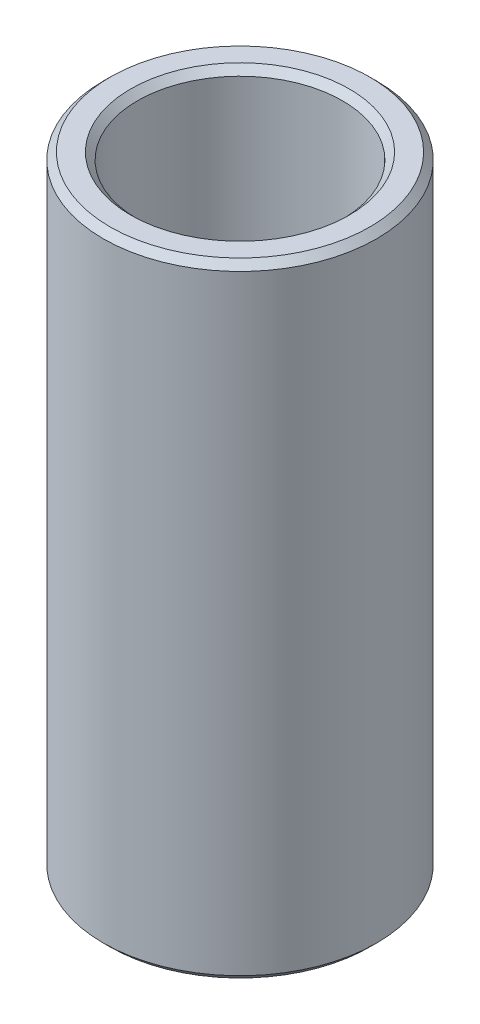
ISO-10303-21;
HEADER;
FILE_DESCRIPTION(('STEP AP214'),'2;1');
FILE_NAME('part.step','',(''),(''),'','','');
FILE_SCHEMA(('AUTOMOTIVE_DESIGN { 1 0 10303 214 1 1 1 1 }'));
ENDSEC;
DATA;
#1=APPLICATION_CONTEXT('core data for automotive mechanical design processes');
#2=APPLICATION_PROTOCOL_DEFINITION('international standard','automotive_design',2000,#1);
#3=PRODUCT_CONTEXT('',#1,'mechanical');
#4=PRODUCT('Part','Part','',(#3));
#5=PRODUCT_RELATED_PRODUCT_CATEGORY('part','',(#4));
#6=PRODUCT_DEFINITION_FORMATION('','',#4);
#7=PRODUCT_DEFINITION_CONTEXT('part definition',#1,'design');
#8=PRODUCT_DEFINITION('design','',#6,#7);
#9=PRODUCT_DEFINITION_SHAPE('','',#8);
#10=(LENGTH_UNIT() NAMED_UNIT(*) SI_UNIT(.MILLI.,.METRE.));
#11=(NAMED_UNIT(*) PLANE_ANGLE_UNIT() SI_UNIT($,.RADIAN.));
#12=(NAMED_UNIT(*) SI_UNIT($,.STERADIAN.) SOLID_ANGLE_UNIT());
#13=UNCERTAINTY_MEASURE_WITH_UNIT(LENGTH_MEASURE(1.E-05),#10,'distance_accuracy_value','');
#14=(GEOMETRIC_REPRESENTATION_CONTEXT(3) GLOBAL_UNCERTAINTY_ASSIGNED_CONTEXT((#13)) GLOBAL_UNIT_ASSIGNED_CONTEXT((#10,
#11,#12)) REPRESENTATION_CONTEXT('',''));
#15=CARTESIAN_POINT('',(0.,0.,0.));
#16=DIRECTION('',(0.,0.,1.));
#17=DIRECTION('',(1.,0.,0.));
#18=AXIS2_PLACEMENT_3D('',#15,#16,#17);
#19=CARTESIAN_POINT('',(0.,18.25,0.));
#20=DIRECTION('',(0.,1.,0.));
#21=DIRECTION('',(0.,0.,1.));
#22=AXIS2_PLACEMENT_3D('',#19,#20,#21);
#23=PLANE('',#22);
#24=CARTESIAN_POINT('',(0.,18.25,0.));
#25=DIRECTION('',(0.,1.,0.));
#26=DIRECTION('',(0.,0.,1.));
#27=AXIS2_PLACEMENT_3D('',#24,#25,#26);
#28=CIRCLE('',#27,3.8);
#29=CARTESIAN_POINT('',(0.,18.25,3.8));
#30=VERTEX_POINT('',#29);
#31=EDGE_CURVE('E45',#30,#30,#28,.T.);
#32=ORIENTED_EDGE('',*,*,#31,.T.);
#33=EDGE_LOOP('',(#32));
#34=FACE_BOUND('',#33,.T.);
#35=CARTESIAN_POINT('',(0.,18.25,0.));
#36=DIRECTION('',(0.,1.,0.));
#37=DIRECTION('',(0.,0.,1.));
#38=AXIS2_PLACEMENT_3D('',#35,#36,#37);
#39=CIRCLE('',#38,3.2);
#40=CARTESIAN_POINT('',(0.,18.25,3.2));
#41=VERTEX_POINT('',#40);
#42=EDGE_CURVE('E49',#41,#41,#39,.F.);
#43=ORIENTED_EDGE('',*,*,#42,.T.);
#44=EDGE_LOOP('',(#43));
#45=FACE_BOUND('',#44,.T.);
#46=ADVANCED_FACE('F34',(#34,#45),#23,.T.);
#47=CARTESIAN_POINT('',(0.,0.,0.));
#48=DIRECTION('',(0.,1.,0.));
#49=DIRECTION('',(0.,0.,1.));
#50=AXIS2_PLACEMENT_3D('',#47,#48,#49);
#51=PLANE('',#50);
#52=CARTESIAN_POINT('',(0.,0.,0.));
#53=DIRECTION('',(0.,1.,0.));
#54=DIRECTION('',(0.,0.,1.));
#55=AXIS2_PLACEMENT_3D('',#52,#53,#54);
#56=CIRCLE('',#55,3.8);
#57=CARTESIAN_POINT('',(0.,0.,3.8));
#58=VERTEX_POINT('',#57);
#59=EDGE_CURVE('E54',#58,#58,#56,.F.);
#60=ORIENTED_EDGE('',*,*,#59,.T.);
#61=EDGE_LOOP('',(#60));
#62=FACE_BOUND('',#61,.T.);
#63=CARTESIAN_POINT('',(0.,0.,0.));
#64=DIRECTION('',(0.,1.,0.));
#65=DIRECTION('',(0.,0.,1.));
#66=AXIS2_PLACEMENT_3D('',#63,#64,#65);
#67=CIRCLE('',#66,3.2);
#68=CARTESIAN_POINT('',(0.,0.,3.2));
#69=VERTEX_POINT('',#68);
#70=EDGE_CURVE('E57',#69,#69,#67,.T.);
#71=ORIENTED_EDGE('',*,*,#70,.T.);
#72=EDGE_LOOP('',(#71));
#73=FACE_BOUND('',#72,.T.);
#74=ADVANCED_FACE('F79',(#62,#73),#51,.F.);
#75=CARTESIAN_POINT('',(0.,18.25,0.));
#76=DIRECTION('',(0.,-1.,0.));
#77=DIRECTION('',(0.,0.,-1.));
#78=AXIS2_PLACEMENT_3D('',#75,#76,#77);
#79=CYLINDRICAL_SURFACE('',#78,4.);
#80=CARTESIAN_POINT('',(0.,0.199999999999995,0.));
#81=DIRECTION('',(0.,1.,0.));
#82=DIRECTION('',(0.,0.,1.));
#83=AXIS2_PLACEMENT_3D('',#80,#81,#82);
#84=CIRCLE('',#83,4.);
#85=CARTESIAN_POINT('',(0.,0.199999999999995,4.));
#86=VERTEX_POINT('',#85);
#87=EDGE_CURVE('E60',#86,#86,#84,.T.);
#88=ORIENTED_EDGE('',*,*,#87,.T.);
#89=EDGE_LOOP('',(#88));
#90=FACE_BOUND('',#89,.T.);
#91=CARTESIAN_POINT('',(0.,18.05,0.));
#92=DIRECTION('',(0.,1.,0.));
#93=DIRECTION('',(0.,0.,1.));
#94=AXIS2_PLACEMENT_3D('',#91,#92,#93);
#95=CIRCLE('',#94,4.);
#96=CARTESIAN_POINT('',(0.,18.05,4.));
#97=VERTEX_POINT('',#96);
#98=EDGE_CURVE('E63',#97,#97,#95,.F.);
#99=ORIENTED_EDGE('',*,*,#98,.T.);
#100=EDGE_LOOP('',(#99));
#101=FACE_BOUND('',#100,.T.);
#102=ADVANCED_FACE('F67',(#90,#101),#79,.T.);
#103=CARTESIAN_POINT('',(0.,18.25,0.));
#104=DIRECTION('',(0.,-1.,0.));
#105=DIRECTION('',(0.,0.,-1.));
#106=AXIS2_PLACEMENT_3D('',#103,#104,#105);
#107=CYLINDRICAL_SURFACE('',#106,3.);
#108=CARTESIAN_POINT('',(0.,0.199999999999999,0.));
#109=DIRECTION('',(0.,1.,0.));
#110=DIRECTION('',(0.,0.,1.));
#111=AXIS2_PLACEMENT_3D('',#108,#109,#110);
#112=CIRCLE('',#111,3.);
#113=CARTESIAN_POINT('',(0.,0.199999999999999,3.));
#114=VERTEX_POINT('',#113);
#115=EDGE_CURVE('E10',#114,#114,#112,.F.);
#116=ORIENTED_EDGE('',*,*,#115,.T.);
#117=EDGE_LOOP('',(#116));
#118=FACE_BOUND('',#117,.T.);
#119=CARTESIAN_POINT('',(0.,18.05,0.));
#120=DIRECTION('',(0.,1.,0.));
#121=DIRECTION('',(0.,0.,1.));
#122=AXIS2_PLACEMENT_3D('',#119,#120,#121);
#123=CIRCLE('',#122,3.);
#124=CARTESIAN_POINT('',(0.,18.05,3.));
#125=VERTEX_POINT('',#124);
#126=EDGE_CURVE('E41',#125,#125,#123,.T.);
#127=ORIENTED_EDGE('',*,*,#126,.T.);
#128=EDGE_LOOP('',(#127));
#129=FACE_BOUND('',#128,.T.);
#130=ADVANCED_FACE('F95',(#118,#129),#107,.F.);
#131=CARTESIAN_POINT('',(0.,0.199999999999995,0.));
#132=DIRECTION('',(0.,1.,0.));
#133=DIRECTION('',(0.,0.,1.));
#134=AXIS2_PLACEMENT_3D('',#131,#132,#133);
#135=CONICAL_SURFACE('',#134,4.,0.785398163397457);
#136=ORIENTED_EDGE('',*,*,#59,.F.);
#137=EDGE_LOOP('',(#136));
#138=FACE_BOUND('',#137,.T.);
#139=ORIENTED_EDGE('',*,*,#87,.F.);
#140=EDGE_LOOP('',(#139));
#141=FACE_BOUND('',#140,.T.);
#142=ADVANCED_FACE('F73',(#138,#141),#135,.T.);
#143=CARTESIAN_POINT('',(0.,18.25,0.));
#144=DIRECTION('',(0.,-1.,0.));
#145=DIRECTION('',(0.,0.,-1.));
#146=AXIS2_PLACEMENT_3D('',#143,#144,#145);
#147=CONICAL_SURFACE('',#146,3.8,0.785398163397448);
#148=ORIENTED_EDGE('',*,*,#98,.F.);
#149=EDGE_LOOP('',(#148));
#150=FACE_BOUND('',#149,.T.);
#151=ORIENTED_EDGE('',*,*,#31,.F.);
#152=EDGE_LOOP('',(#151));
#153=FACE_BOUND('',#152,.T.);
#154=ADVANCED_FACE('F69',(#150,#153),#147,.T.);
#155=CARTESIAN_POINT('',(0.,0.,0.));
#156=DIRECTION('',(0.,-1.,0.));
#157=DIRECTION('',(0.,0.,-1.));
#158=AXIS2_PLACEMENT_3D('',#155,#156,#157);
#159=CONICAL_SURFACE('',#158,3.2,0.785398163397444);
#160=ORIENTED_EDGE('',*,*,#115,.F.);
#161=EDGE_LOOP('',(#160));
#162=FACE_BOUND('',#161,.T.);
#163=ORIENTED_EDGE('',*,*,#70,.F.);
#164=EDGE_LOOP('',(#163));
#165=FACE_BOUND('',#164,.T.);
#166=ADVANCED_FACE('F72',(#162,#165),#159,.F.);
#167=CARTESIAN_POINT('',(0.,18.05,0.));
#168=DIRECTION('',(0.,1.,0.));
#169=DIRECTION('',(0.,0.,1.));
#170=AXIS2_PLACEMENT_3D('',#167,#168,#169);
#171=CONICAL_SURFACE('',#170,3.,0.785398163397449);
#172=ORIENTED_EDGE('',*,*,#42,.F.);
#173=EDGE_LOOP('',(#172));
#174=FACE_BOUND('',#173,.T.);
#175=ORIENTED_EDGE('',*,*,#126,.F.);
#176=EDGE_LOOP('',(#175));
#177=FACE_BOUND('',#176,.T.);
#178=ADVANCED_FACE('F36',(#174,#177),#171,.F.);
#179=CLOSED_SHELL('',(#46,#74,#102,#130,#142,#154,#166,#178));
#180=MANIFOLD_SOLID_BREP('B2',#179);
#181=ADVANCED_BREP_SHAPE_REPRESENTATION('',(#18,#180),#14);
#182=SHAPE_DEFINITION_REPRESENTATION(#9,#181);
ENDSEC;
END-ISO-10303-21;
